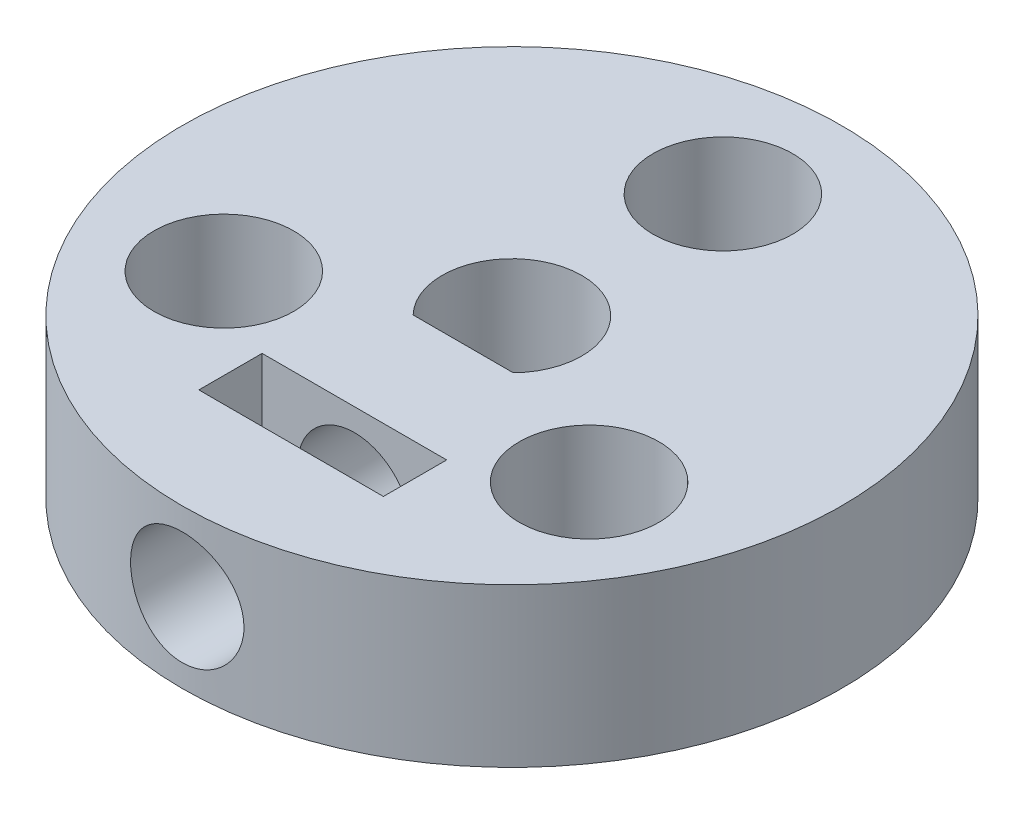
ISO-10303-21;
HEADER;
FILE_DESCRIPTION(('STEP AP214'),'2;1');
FILE_NAME('part.step','',(''),(''),'','','');
FILE_SCHEMA(('AUTOMOTIVE_DESIGN { 1 0 10303 214 1 1 1 1 }'));
ENDSEC;
DATA;
#1=APPLICATION_CONTEXT('core data for automotive mechanical design processes');
#2=APPLICATION_PROTOCOL_DEFINITION('international standard','automotive_design',2000,#1);
#3=PRODUCT_CONTEXT('',#1,'mechanical');
#4=PRODUCT('Part','Part','',(#3));
#5=PRODUCT_RELATED_PRODUCT_CATEGORY('part','',(#4));
#6=PRODUCT_DEFINITION_FORMATION('','',#4);
#7=PRODUCT_DEFINITION_CONTEXT('part definition',#1,'design');
#8=PRODUCT_DEFINITION('design','',#6,#7);
#9=PRODUCT_DEFINITION_SHAPE('','',#8);
#10=(LENGTH_UNIT() NAMED_UNIT(*) SI_UNIT(.MILLI.,.METRE.));
#11=(NAMED_UNIT(*) PLANE_ANGLE_UNIT() SI_UNIT($,.RADIAN.));
#12=(NAMED_UNIT(*) SI_UNIT($,.STERADIAN.) SOLID_ANGLE_UNIT());
#13=UNCERTAINTY_MEASURE_WITH_UNIT(LENGTH_MEASURE(1.E-05),#10,'distance_accuracy_value','');
#14=(GEOMETRIC_REPRESENTATION_CONTEXT(3) GLOBAL_UNCERTAINTY_ASSIGNED_CONTEXT((#13)) GLOBAL_UNIT_ASSIGNED_CONTEXT((#10,
#11,#12)) REPRESENTATION_CONTEXT('',''));
#15=CARTESIAN_POINT('',(0.,0.,0.));
#16=DIRECTION('',(0.,0.,1.));
#17=DIRECTION('',(1.,0.,0.));
#18=AXIS2_PLACEMENT_3D('',#15,#16,#17);
#19=CARTESIAN_POINT('',(0.,6.,0.));
#20=DIRECTION('',(0.,-1.,0.));
#21=DIRECTION('',(0.,0.,-1.));
#22=AXIS2_PLACEMENT_3D('',#19,#20,#21);
#23=CYLINDRICAL_SURFACE('',#22,12.5);
#24=CARTESIAN_POINT('',(0.,6.,0.));
#25=DIRECTION('',(0.,1.,0.));
#26=DIRECTION('',(0.,0.,1.));
#27=AXIS2_PLACEMENT_3D('',#24,#25,#26);
#28=CIRCLE('',#27,12.5);
#29=CARTESIAN_POINT('',(0.,6.,12.5));
#30=VERTEX_POINT('',#29);
#31=EDGE_CURVE('E11',#30,#30,#28,.T.);
#32=ORIENTED_EDGE('',*,*,#31,.F.);
#33=EDGE_LOOP('',(#32));
#34=FACE_BOUND('',#33,.T.);
#35=CARTESIAN_POINT('',(0.,0.,0.));
#36=DIRECTION('',(0.,1.,0.));
#37=DIRECTION('',(0.,0.,1.));
#38=AXIS2_PLACEMENT_3D('',#35,#36,#37);
#39=CIRCLE('',#38,12.5);
#40=CARTESIAN_POINT('',(0.,0.,12.5));
#41=VERTEX_POINT('',#40);
#42=EDGE_CURVE('E42',#41,#41,#39,.T.);
#43=ORIENTED_EDGE('',*,*,#42,.T.);
#44=EDGE_LOOP('',(#43));
#45=FACE_BOUND('',#44,.T.);
#46=CARTESIAN_POINT('',(2.15,3.,12.3137118692943));
#47=CARTESIAN_POINT('',(2.14999523512058,3.11980416009532,12.3137140770646));
#48=CARTESIAN_POINT('',(2.13995232522662,3.23967232651527,12.3154792484177));
#49=CARTESIAN_POINT('',(2.10006584294662,3.47604128226782,12.3223422036724));
#50=CARTESIAN_POINT('',(2.0702043695401,3.59253892782505,12.3274430004002));
#51=CARTESIAN_POINT('',(1.99161427828626,3.81871203809173,12.3403827913077));
#52=CARTESIAN_POINT('',(1.94290187028168,3.92839327041843,12.3482194323808));
#53=CARTESIAN_POINT('',(1.82803371245467,4.13801540896396,12.3657451390108));
#54=CARTESIAN_POINT('',(1.76187977704996,4.23795732686974,12.3754340118538));
#55=CARTESIAN_POINT('',(1.6132663044418,4.42632309518145,12.3956860501078));
#56=CARTESIAN_POINT('',(1.53065945452883,4.51462994679526,12.4062565724943));
#57=CARTESIAN_POINT('',(1.35180343371248,4.6762018723454,12.4270156183443));
#58=CARTESIAN_POINT('',(1.25555343411335,4.74946603191429,12.4372041185559));
#59=CARTESIAN_POINT('',(1.05138257583156,4.87931431556168,12.4561292552848));
#60=CARTESIAN_POINT('',(0.943391265372705,4.93578919148946,12.464856227903));
#61=CARTESIAN_POINT('',(0.719279368598096,5.02975318797184,12.479793025359));
#62=CARTESIAN_POINT('',(0.603159345566699,5.06724362258606,12.4860030244101));
#63=CARTESIAN_POINT('',(0.367296001481081,5.12181568075943,12.4951542325278));
#64=CARTESIAN_POINT('',(0.247599446496765,5.13909406206646,12.4981269356312));
#65=CARTESIAN_POINT('',(0.00697182502378487,5.15336368006842,12.500576900139));
#66=CARTESIAN_POINT('',(-0.11395915171639,5.15035638128843,12.5000544138788));
#67=CARTESIAN_POINT('',(-0.352276552091909,5.1242928252659,12.4955977220906));
#68=CARTESIAN_POINT('',(-0.469686907105693,5.10144834359743,12.4916995554795));
#69=CARTESIAN_POINT('',(-0.698982638401656,5.03669272377834,12.48096973508));
#70=CARTESIAN_POINT('',(-0.810867837833076,4.99478097575518,12.4741379874605));
#71=CARTESIAN_POINT('',(-1.02656324228791,4.89287221966631,12.4582475265903));
#72=CARTESIAN_POINT('',(-1.13033170674949,4.83278859007667,12.4491781862258));
#73=CARTESIAN_POINT('',(-1.32639319040894,4.69630517180203,12.4298190360616));
#74=CARTESIAN_POINT('',(-1.41868522096564,4.61990397897372,12.419529121264));
#75=CARTESIAN_POINT('',(-1.59042613389989,4.45178142118165,12.3987151855607));
#76=CARTESIAN_POINT('',(-1.66969372028435,4.35987491105816,12.3881898575719));
#77=CARTESIAN_POINT('',(-1.81171308204382,4.16397268273662,12.3682195486175));
#78=CARTESIAN_POINT('',(-1.8744646852251,4.05997683851285,12.3587745789162));
#79=CARTESIAN_POINT('',(-1.98171032999896,3.84263039114169,12.3420333895227));
#80=CARTESIAN_POINT('',(-2.02618144008044,3.72926825135463,12.3347398718837));
#81=CARTESIAN_POINT('',(-2.09539849731496,3.49652896689196,12.32317120851));
#82=CARTESIAN_POINT('',(-2.12014630177335,3.37715238971012,12.3188957785722));
#83=CARTESIAN_POINT('',(-2.14895666389343,3.13739812524455,12.3139026785409));
#84=CARTESIAN_POINT('',(-2.15327815678057,3.01705245140095,12.3131404759316));
#85=CARTESIAN_POINT('',(-2.14180424902303,2.77735784204362,12.3151413798204));
#86=CARTESIAN_POINT('',(-2.12600967824831,2.65800886561648,12.3179043408911));
#87=CARTESIAN_POINT('',(-2.07497314222381,2.4245250724513,12.3266030290423));
#88=CARTESIAN_POINT('',(-2.03986394143355,2.31036035615583,12.3325170875425));
#89=CARTESIAN_POINT('',(-1.95133440471402,2.08953472165864,12.3468333046011));
#90=CARTESIAN_POINT('',(-1.89791290977061,1.98287427892942,12.3552356206407));
#91=CARTESIAN_POINT('',(-1.77366783491972,1.77893533733172,12.3736845927819));
#92=CARTESIAN_POINT('',(-1.7026789002696,1.68175898654014,12.3837465514737));
#93=CARTESIAN_POINT('',(-1.54554003352175,1.50060481294295,12.4043367500405));
#94=CARTESIAN_POINT('',(-1.45938896285976,1.41662798222081,12.414865024888));
#95=CARTESIAN_POINT('',(-1.27322184032392,1.26330576352965,12.4353430002284));
#96=CARTESIAN_POINT('',(-1.17306229228865,1.19413342061692,12.4452849671113));
#97=CARTESIAN_POINT('',(-0.96239355163567,1.07359805491092,12.463344628757));
#98=CARTESIAN_POINT('',(-0.85188471048062,1.02223442761088,12.4714623854382));
#99=CARTESIAN_POINT('',(-0.624159537877468,0.939041305687561,12.4849254493442));
#100=CARTESIAN_POINT('',(-0.506976565115973,0.9071226317407,12.4902833959735));
#101=CARTESIAN_POINT('',(-0.268813454064623,0.863438889378121,12.4976767018206));
#102=CARTESIAN_POINT('',(-0.147833650386974,0.851672050045107,12.4997123529968));
#103=CARTESIAN_POINT('',(0.0928214209370931,0.848679586537874,12.5002271669382));
#104=CARTESIAN_POINT('',(0.212493404229969,0.85719115485527,12.4987518322445));
#105=CARTESIAN_POINT('',(0.448676000370172,0.893943700376464,12.492503738834));
#106=CARTESIAN_POINT('',(0.565186633792047,0.922184549147093,12.4877310015825));
#107=CARTESIAN_POINT('',(0.791629347641567,0.997490658558319,12.4754228533213));
#108=CARTESIAN_POINT('',(0.901569524036275,1.04453217976856,12.4678909273093));
#109=CARTESIAN_POINT('',(1.11203684347077,1.15607452695737,12.4508849134721));
#110=CARTESIAN_POINT('',(1.21256349345213,1.22057626677355,12.4414107239985));
#111=CARTESIAN_POINT('',(1.40267067903647,1.36613319180138,12.4214240278329));
#112=CARTESIAN_POINT('',(1.49210316364768,1.44738022085855,12.4109002911752));
#113=CARTESIAN_POINT('',(1.65615738647813,1.62371972812979,12.3900766153397));
#114=CARTESIAN_POINT('',(1.73077564976339,1.7188154457484,12.3797767291733));
#115=CARTESIAN_POINT('',(1.8636070111843,1.92101206629418,12.3604822378488));
#116=CARTESIAN_POINT('',(1.92169126937328,2.02819862602798,12.3514981353079));
#117=CARTESIAN_POINT('',(2.01893940789672,2.25092081171649,12.3359770256205));
#118=CARTESIAN_POINT('',(2.05812193626849,2.36644807897341,12.3294376080407));
#119=CARTESIAN_POINT('',(2.10807759763052,2.56866651038761,12.3209755030038));
#120=CARTESIAN_POINT('',(2.12377286240474,2.65414255269861,12.3182670340709));
#121=CARTESIAN_POINT('',(2.14473568487324,2.82640121061802,12.3146344352781));
#122=CARTESIAN_POINT('',(2.15000345287447,2.91318379983977,12.3137102694315));
#123=CARTESIAN_POINT('',(2.15,3.,12.3137118692943));
#124=B_SPLINE_CURVE_WITH_KNOTS('',3,(#46,#47,#48,#49,#50,#51,#52,#53,#54,#55,#56,#57,#58,#59,
#60,#61,#62,#63,#64,#65,#66,#67,#68,#69,#70,#71,#72,#73,#74,#75,#76,#77,#78,#79,#80,#81,#82,#83,
#84,#85,#86,#87,#88,#89,#90,#91,#92,#93,#94,#95,#96,#97,#98,#99,#100,#101,#102,#103,#104,#105,
#106,#107,#108,#109,#110,#111,#112,#113,#114,#115,#116,#117,#118,#119,#120,#121,#122,#123),
.UNSPECIFIED.,.T.,.F.,(4,2,2,2,2,2,2,2,2,2,2,2,2,2,2,2,2,2,2,2,2,2,2,2,2,2,2,2,2,2,2,2,2,2,2,2,
2,2,4),(0.,0.359094953771007,0.718514700533363,1.07762606800529,1.43670009235372,
1.7991466809144,2.16161529421027,2.52639331601842,2.89114608527394,3.25231775149959,
3.61346334320867,3.97080020746036,4.32814850204867,4.68722779087923,5.04633799131521,
5.41008687068965,5.77383954231768,6.13804713214381,6.50222042119539,6.861764639213,
7.22129402504035,7.57838241741689,7.93549341465846,8.29610289680723,8.65673946962372,
9.02138543167999,9.38601901482349,9.74896745596803,10.1118840000336,10.4701227949832,
10.8283592579006,11.1861448009903,11.5439490735776,11.9061064319091,12.2683486404564,
12.6333408070087,12.9979721399905,13.2581958929518,13.5184143975372),.UNSPECIFIED.);
#125=CARTESIAN_POINT('',(2.15,3.,12.3137118692943));
#126=VERTEX_POINT('',#125);
#127=EDGE_CURVE('E175',#126,#126,#124,.T.);
#128=ORIENTED_EDGE('',*,*,#127,.F.);
#129=EDGE_LOOP('',(#128));
#130=FACE_BOUND('',#129,.T.);
#131=ADVANCED_FACE('F33',(#34,#45,#130),#23,.T.);
#132=CARTESIAN_POINT('',(0.,-0.00100000000000013,1.85));
#133=DIRECTION('',(0.,0.,1.));
#134=DIRECTION('',(1.,0.,0.));
#135=AXIS2_PLACEMENT_3D('',#132,#133,#134);
#136=PLANE('',#135);
#137=CARTESIAN_POINT('',(0.,3.,1.85));
#138=DIRECTION('',(0.,0.,1.));
#139=DIRECTION('',(1.,0.,0.));
#140=AXIS2_PLACEMENT_3D('',#137,#138,#139);
#141=CIRCLE('',#140,2.15);
#142=CARTESIAN_POINT('',(1.89736659610103,1.98881257919217,1.85));
#143=VERTEX_POINT('',#142);
#144=CARTESIAN_POINT('',(-1.89736659610103,1.98881257919217,1.85));
#145=VERTEX_POINT('',#144);
#146=EDGE_CURVE('E100',#143,#145,#141,.F.);
#147=ORIENTED_EDGE('',*,*,#146,.F.);
#148=DIRECTION('',(0.,1.,0.));
#149=VECTOR('',#148,1.);
#150=CARTESIAN_POINT('',(1.89736659610103,-0.00100000000000013,1.85));
#151=LINE('',#150,#149);
#152=CARTESIAN_POINT('',(1.89736659610103,0.,1.85));
#153=VERTEX_POINT('',#152);
#154=EDGE_CURVE('E110',#153,#143,#151,.T.);
#155=ORIENTED_EDGE('',*,*,#154,.F.);
#156=DIRECTION('',(-1.,0.,0.));
#157=VECTOR('',#156,1.);
#158=CARTESIAN_POINT('',(0.,0.,1.85));
#159=LINE('',#158,#157);
#160=CARTESIAN_POINT('',(-1.89736659610103,0.,1.85));
#161=VERTEX_POINT('',#160);
#162=EDGE_CURVE('E218',#153,#161,#159,.T.);
#163=ORIENTED_EDGE('',*,*,#162,.T.);
#164=DIRECTION('',(0.,1.,0.));
#165=VECTOR('',#164,1.);
#166=CARTESIAN_POINT('',(-1.89736659610103,-0.00100000000000013,1.85));
#167=LINE('',#166,#165);
#168=EDGE_CURVE('E113',#161,#145,#167,.T.);
#169=ORIENTED_EDGE('',*,*,#168,.T.);
#170=EDGE_LOOP('',(#147,#155,#163,#169));
#171=FACE_BOUND('',#170,.T.);
#172=ADVANCED_FACE('F109',(#171),#136,.F.);
#173=CARTESIAN_POINT('',(0.,-0.00100000000000013,0.));
#174=DIRECTION('',(0.,1.,0.));
#175=DIRECTION('',(0.,0.,1.));
#176=AXIS2_PLACEMENT_3D('',#173,#174,#175);
#177=CYLINDRICAL_SURFACE('',#176,2.65);
#178=CARTESIAN_POINT('',(-1.89736659610103,1.98881257919217,1.85));
#179=CARTESIAN_POINT('',(-1.91720669890696,2.02605383556159,1.82965527369401));
#180=CARTESIAN_POINT('',(-1.93603961831095,2.06401971105243,1.80968093366379));
#181=CARTESIAN_POINT('',(-1.97164111491819,2.14153571782848,1.77082619429323));
#182=CARTESIAN_POINT('',(-1.98840633124944,2.18108829341598,1.75194760168542));
#183=CARTESIAN_POINT('',(-2.03584649348657,2.30320759708302,1.6971075649108));
#184=CARTESIAN_POINT('',(-2.06313835646978,2.38825939658803,1.66349862884322));
#185=CARTESIAN_POINT('',(-2.10339037462589,2.54857926525862,1.61218052637965));
#186=CARTESIAN_POINT('',(-2.118049378749,2.62283689732512,1.59269547151605));
#187=CARTESIAN_POINT('',(-2.13944235239509,2.77403407288728,1.56384757679862));
#188=CARTESIAN_POINT('',(-2.14622539705263,2.85095389950346,1.55442208585384));
#189=CARTESIAN_POINT('',(-2.15139987385191,3.0061574240331,1.54725764209384));
#190=CARTESIAN_POINT('',(-2.14973644777306,3.08444673836905,1.54959508642809));
#191=CARTESIAN_POINT('',(-2.13805336890989,3.23937212965978,1.56566708620453));
#192=CARTESIAN_POINT('',(-2.12800719982723,3.31600216785323,1.57943780670327));
#193=CARTESIAN_POINT('',(-2.09643886532097,3.48682358675667,1.62120125478484));
#194=CARTESIAN_POINT('',(-2.07246626737269,3.57981480742485,1.65212404189149));
#195=CARTESIAN_POINT('',(-2.01394064273109,3.75857176502394,1.72297277737756));
#196=CARTESIAN_POINT('',(-1.9793807698391,3.84433278069162,1.76290454694579));
#197=CARTESIAN_POINT('',(-1.92641869280659,3.9551983048563,1.81984352566436));
#198=CARTESIAN_POINT('',(-1.91216708745196,3.98340437607689,1.83482858497551));
#199=CARTESIAN_POINT('',(-1.89736659610105,4.01118742080784,1.85000000000001));
#200=B_SPLINE_CURVE_WITH_KNOTS('',3,(#178,#179,#180,#181,#182,#183,#184,#185,#186,#187,#188,
#189,#190,#191,#192,#193,#194,#195,#196,#197,#198,#199),.UNSPECIFIED.,.F.,.F.,(4,2,2,2,2,2,2,2,
2,2,4),(0.,0.14048637773369,0.281198175850233,0.566322323145036,0.799908155945843,
1.03203056861612,1.2656624929399,1.50003625592549,1.80103448372852,2.10222776257815,
2.20710702633954),.UNSPECIFIED.);
#201=CARTESIAN_POINT('',(-1.89736659610103,4.01118742080783,1.85));
#202=VERTEX_POINT('',#201);
#203=EDGE_CURVE('E114',#145,#202,#200,.T.);
#204=ORIENTED_EDGE('',*,*,#203,.F.);
#205=ORIENTED_EDGE('',*,*,#168,.F.);
#206=CARTESIAN_POINT('',(0.,0.,0.));
#207=DIRECTION('',(0.,1.,0.));
#208=DIRECTION('',(0.,0.,1.));
#209=AXIS2_PLACEMENT_3D('',#206,#207,#208);
#210=CIRCLE('',#209,2.65);
#211=EDGE_CURVE('E118',#161,#153,#210,.F.);
#212=ORIENTED_EDGE('',*,*,#211,.T.);
#213=ORIENTED_EDGE('',*,*,#154,.T.);
#214=CARTESIAN_POINT('',(1.89736659610103,4.01118742080783,1.85));
#215=CARTESIAN_POINT('',(1.91720669890695,3.97394616443841,1.82965527369401));
#216=CARTESIAN_POINT('',(1.93603961831095,3.93598028894757,1.80968093366379));
#217=CARTESIAN_POINT('',(1.97164111491819,3.85846428217152,1.77082619429323));
#218=CARTESIAN_POINT('',(1.98840633124944,3.81891170658402,1.75194760168542));
#219=CARTESIAN_POINT('',(2.03584649348657,3.69679240291698,1.6971075649108));
#220=CARTESIAN_POINT('',(2.06313835646978,3.61174060341196,1.66349862884322));
#221=CARTESIAN_POINT('',(2.10339037462589,3.45142073474138,1.61218052637965));
#222=CARTESIAN_POINT('',(2.118049378749,3.37716310267488,1.59269547151605));
#223=CARTESIAN_POINT('',(2.13944235239509,3.22596592711272,1.56384757679862));
#224=CARTESIAN_POINT('',(2.14622539705263,3.14904610049654,1.55442208585384));
#225=CARTESIAN_POINT('',(2.15139987385191,2.9938425759669,1.54725764209384));
#226=CARTESIAN_POINT('',(2.14973644777306,2.91555326163095,1.54959508642809));
#227=CARTESIAN_POINT('',(2.13805336890989,2.76062787034022,1.56566708620453));
#228=CARTESIAN_POINT('',(2.12800719982723,2.68399783214677,1.57943780670327));
#229=CARTESIAN_POINT('',(2.09643886532097,2.51317641324333,1.62120125478484));
#230=CARTESIAN_POINT('',(2.0724662673727,2.42018519257515,1.65212404189149));
#231=CARTESIAN_POINT('',(2.01394064273109,2.24142823497606,1.72297277737756));
#232=CARTESIAN_POINT('',(1.9793807698391,2.15566721930838,1.76290454694579));
#233=CARTESIAN_POINT('',(1.92641869280659,2.0448016951437,1.81984352566436));
#234=CARTESIAN_POINT('',(1.91216708745196,2.01659562392311,1.83482858497551));
#235=CARTESIAN_POINT('',(1.89736659610105,1.98881257919216,1.85000000000001));
#236=B_SPLINE_CURVE_WITH_KNOTS('',3,(#214,#215,#216,#217,#218,#219,#220,#221,#222,#223,#224,
#225,#226,#227,#228,#229,#230,#231,#232,#233,#234,#235),.UNSPECIFIED.,.F.,.F.,(4,2,2,2,2,2,2,2,
2,2,4),(0.,0.14048637773369,0.281198175850233,0.566322323145035,0.799908155945843,
1.03203056861612,1.2656624929399,1.50003625592549,1.80103448372852,2.10222776257815,
2.20710702633954),.UNSPECIFIED.);
#237=CARTESIAN_POINT('',(1.89736659610103,4.01118742080783,1.85));
#238=VERTEX_POINT('',#237);
#239=EDGE_CURVE('E97',#238,#143,#236,.T.);
#240=ORIENTED_EDGE('',*,*,#239,.F.);
#241=CARTESIAN_POINT('',(1.89736659610103,6.,1.85));
#242=VERTEX_POINT('',#241);
#243=EDGE_CURVE('E121',#238,#242,#151,.T.);
#244=ORIENTED_EDGE('',*,*,#243,.T.);
#245=CARTESIAN_POINT('',(0.,6.,0.));
#246=DIRECTION('',(0.,1.,0.));
#247=DIRECTION('',(0.,0.,1.));
#248=AXIS2_PLACEMENT_3D('',#245,#246,#247);
#249=CIRCLE('',#248,2.65);
#250=CARTESIAN_POINT('',(-1.89736659610103,6.,1.85));
#251=VERTEX_POINT('',#250);
#252=EDGE_CURVE('E124',#242,#251,#249,.T.);
#253=ORIENTED_EDGE('',*,*,#252,.T.);
#254=EDGE_CURVE('E120',#202,#251,#167,.T.);
#255=ORIENTED_EDGE('',*,*,#254,.F.);
#256=EDGE_LOOP('',(#204,#205,#212,#213,#240,#244,#253,#255));
#257=FACE_BOUND('',#256,.T.);
#258=ADVANCED_FACE('F116',(#257),#177,.F.);
#259=CARTESIAN_POINT('',(0.,6.,0.));
#260=DIRECTION('',(0.,1.,0.));
#261=DIRECTION('',(0.,0.,1.));
#262=AXIS2_PLACEMENT_3D('',#259,#260,#261);
#263=PLANE('',#262);
#264=CARTESIAN_POINT('',(0.,6.,-8.));
#265=DIRECTION('',(0.,1.,0.));
#266=DIRECTION('',(0.,0.,1.));
#267=AXIS2_PLACEMENT_3D('',#264,#265,#266);
#268=CIRCLE('',#267,2.65);
#269=CARTESIAN_POINT('',(0.,6.,-5.35));
#270=VERTEX_POINT('',#269);
#271=EDGE_CURVE('E357',#270,#270,#268,.T.);
#272=ORIENTED_EDGE('',*,*,#271,.F.);
#273=EDGE_LOOP('',(#272));
#274=FACE_BOUND('',#273,.T.);
#275=CARTESIAN_POINT('',(6.92820323027585,6.,3.9999999999998));
#276=DIRECTION('',(0.,1.,0.));
#277=DIRECTION('',(0.,0.,1.));
#278=AXIS2_PLACEMENT_3D('',#275,#276,#277);
#279=CIRCLE('',#278,2.6500000000003);
#280=CARTESIAN_POINT('',(6.92820323027585,6.,6.65000000000011));
#281=VERTEX_POINT('',#280);
#282=EDGE_CURVE('E362',#281,#281,#279,.T.);
#283=ORIENTED_EDGE('',*,*,#282,.F.);
#284=EDGE_LOOP('',(#283));
#285=FACE_BOUND('',#284,.T.);
#286=CARTESIAN_POINT('',(-6.92820323027517,6.,4.0000000000002));
#287=DIRECTION('',(0.,1.,0.));
#288=DIRECTION('',(0.,0.,1.));
#289=AXIS2_PLACEMENT_3D('',#286,#287,#288);
#290=CIRCLE('',#289,2.65000000000045);
#291=CARTESIAN_POINT('',(-6.92820323027517,6.,6.65000000000065));
#292=VERTEX_POINT('',#291);
#293=EDGE_CURVE('E370',#292,#292,#290,.T.);
#294=ORIENTED_EDGE('',*,*,#293,.F.);
#295=EDGE_LOOP('',(#294));
#296=FACE_BOUND('',#295,.T.);
#297=DIRECTION('',(0.,0.,-1.));
#298=VECTOR('',#297,1.);
#299=CARTESIAN_POINT('',(3.5,6.,8.375));
#300=LINE('',#299,#298);
#301=CARTESIAN_POINT('',(3.5,6.,8.375));
#302=VERTEX_POINT('',#301);
#303=CARTESIAN_POINT('',(3.5,6.,5.975));
#304=VERTEX_POINT('',#303);
#305=EDGE_CURVE('E58',#302,#304,#300,.T.);
#306=ORIENTED_EDGE('',*,*,#305,.F.);
#307=DIRECTION('',(1.,0.,0.));
#308=VECTOR('',#307,1.);
#309=CARTESIAN_POINT('',(-3.5,6.,8.375));
#310=LINE('',#309,#308);
#311=CARTESIAN_POINT('',(-3.5,6.,8.375));
#312=VERTEX_POINT('',#311);
#313=EDGE_CURVE('E237',#312,#302,#310,.T.);
#314=ORIENTED_EDGE('',*,*,#313,.F.);
#315=DIRECTION('',(0.,0.,1.));
#316=VECTOR('',#315,1.);
#317=CARTESIAN_POINT('',(-3.5,6.,8.375));
#318=LINE('',#317,#316);
#319=CARTESIAN_POINT('',(-3.5,6.,5.975));
#320=VERTEX_POINT('',#319);
#321=EDGE_CURVE('E234',#320,#312,#318,.T.);
#322=ORIENTED_EDGE('',*,*,#321,.F.);
#323=DIRECTION('',(-1.,0.,0.));
#324=VECTOR('',#323,1.);
#325=CARTESIAN_POINT('',(-3.5,6.,5.975));
#326=LINE('',#325,#324);
#327=EDGE_CURVE('E228',#304,#320,#326,.T.);
#328=ORIENTED_EDGE('',*,*,#327,.F.);
#329=EDGE_LOOP('',(#306,#314,#322,#328));
#330=FACE_BOUND('',#329,.T.);
#331=DIRECTION('',(1.,0.,0.));
#332=VECTOR('',#331,1.);
#333=CARTESIAN_POINT('',(0.,6.,1.85));
#334=LINE('',#333,#332);
#335=EDGE_CURVE('E246',#251,#242,#334,.T.);
#336=ORIENTED_EDGE('',*,*,#335,.F.);
#337=ORIENTED_EDGE('',*,*,#252,.F.);
#338=EDGE_LOOP('',(#336,#337));
#339=FACE_BOUND('',#338,.T.);
#340=ORIENTED_EDGE('',*,*,#31,.T.);
#341=EDGE_LOOP('',(#340));
#342=FACE_BOUND('',#341,.T.);
#343=ADVANCED_FACE('F135',(#274,#285,#296,#330,#339,#342),#263,.T.);
#344=CARTESIAN_POINT('',(0.,0.,0.));
#345=DIRECTION('',(0.,1.,0.));
#346=DIRECTION('',(0.,0.,1.));
#347=AXIS2_PLACEMENT_3D('',#344,#345,#346);
#348=PLANE('',#347);
#349=CARTESIAN_POINT('',(0.,0.,-8.));
#350=DIRECTION('',(0.,1.,0.));
#351=DIRECTION('',(0.,0.,1.));
#352=AXIS2_PLACEMENT_3D('',#349,#350,#351);
#353=CIRCLE('',#352,2.65);
#354=CARTESIAN_POINT('',(0.,0.,-5.35));
#355=VERTEX_POINT('',#354);
#356=EDGE_CURVE('E354',#355,#355,#353,.T.);
#357=ORIENTED_EDGE('',*,*,#356,.T.);
#358=EDGE_LOOP('',(#357));
#359=FACE_BOUND('',#358,.T.);
#360=CARTESIAN_POINT('',(6.92820323027585,0.,3.9999999999998));
#361=DIRECTION('',(0.,1.,0.));
#362=DIRECTION('',(0.,0.,1.));
#363=AXIS2_PLACEMENT_3D('',#360,#361,#362);
#364=CIRCLE('',#363,2.6500000000003);
#365=CARTESIAN_POINT('',(6.92820323027585,0.,6.65000000000011));
#366=VERTEX_POINT('',#365);
#367=EDGE_CURVE('E358',#366,#366,#364,.T.);
#368=ORIENTED_EDGE('',*,*,#367,.T.);
#369=EDGE_LOOP('',(#368));
#370=FACE_BOUND('',#369,.T.);
#371=CARTESIAN_POINT('',(-6.92820323027517,0.,4.0000000000002));
#372=DIRECTION('',(0.,1.,0.));
#373=DIRECTION('',(0.,0.,1.));
#374=AXIS2_PLACEMENT_3D('',#371,#372,#373);
#375=CIRCLE('',#374,2.65000000000045);
#376=CARTESIAN_POINT('',(-6.92820323027517,0.,6.65000000000065));
#377=VERTEX_POINT('',#376);
#378=EDGE_CURVE('E367',#377,#377,#375,.T.);
#379=ORIENTED_EDGE('',*,*,#378,.T.);
#380=EDGE_LOOP('',(#379));
#381=FACE_BOUND('',#380,.T.);
#382=DIRECTION('',(-1.,0.,0.));
#383=VECTOR('',#382,1.);
#384=CARTESIAN_POINT('',(-3.5,0.,8.375));
#385=LINE('',#384,#383);
#386=CARTESIAN_POINT('',(3.5,0.,8.375));
#387=VERTEX_POINT('',#386);
#388=CARTESIAN_POINT('',(-3.5,0.,8.375));
#389=VERTEX_POINT('',#388);
#390=EDGE_CURVE('E226',#387,#389,#385,.T.);
#391=ORIENTED_EDGE('',*,*,#390,.F.);
#392=DIRECTION('',(0.,0.,1.));
#393=VECTOR('',#392,1.);
#394=CARTESIAN_POINT('',(3.5,0.,8.375));
#395=LINE('',#394,#393);
#396=CARTESIAN_POINT('',(3.5,0.,5.975));
#397=VERTEX_POINT('',#396);
#398=EDGE_CURVE('E223',#397,#387,#395,.T.);
#399=ORIENTED_EDGE('',*,*,#398,.F.);
#400=DIRECTION('',(1.,0.,0.));
#401=VECTOR('',#400,1.);
#402=CARTESIAN_POINT('',(-3.5,0.,5.975));
#403=LINE('',#402,#401);
#404=CARTESIAN_POINT('',(-3.5,0.,5.975));
#405=VERTEX_POINT('',#404);
#406=EDGE_CURVE('E210',#405,#397,#403,.T.);
#407=ORIENTED_EDGE('',*,*,#406,.F.);
#408=DIRECTION('',(0.,0.,-1.));
#409=VECTOR('',#408,1.);
#410=CARTESIAN_POINT('',(-3.5,0.,8.375));
#411=LINE('',#410,#409);
#412=EDGE_CURVE('E230',#389,#405,#411,.T.);
#413=ORIENTED_EDGE('',*,*,#412,.F.);
#414=EDGE_LOOP('',(#391,#399,#407,#413));
#415=FACE_BOUND('',#414,.T.);
#416=ORIENTED_EDGE('',*,*,#211,.F.);
#417=ORIENTED_EDGE('',*,*,#162,.F.);
#418=EDGE_LOOP('',(#416,#417));
#419=FACE_BOUND('',#418,.T.);
#420=ORIENTED_EDGE('',*,*,#42,.F.);
#421=EDGE_LOOP('',(#420));
#422=FACE_BOUND('',#421,.T.);
#423=ADVANCED_FACE('F132',(#359,#370,#381,#415,#419,#422),#348,.F.);
#424=EDGE_CURVE('E50',#202,#238,#141,.F.);
#425=ORIENTED_EDGE('',*,*,#424,.F.);
#426=ORIENTED_EDGE('',*,*,#254,.T.);
#427=ORIENTED_EDGE('',*,*,#335,.T.);
#428=ORIENTED_EDGE('',*,*,#243,.F.);
#429=EDGE_LOOP('',(#425,#426,#427,#428));
#430=FACE_BOUND('',#429,.T.);
#431=ADVANCED_FACE('F134',(#430),#136,.F.);
#432=CARTESIAN_POINT('',(3.5,-0.00100000000000013,8.375));
#433=DIRECTION('',(1.,0.,0.));
#434=DIRECTION('',(0.,0.,-1.));
#435=AXIS2_PLACEMENT_3D('',#432,#433,#434);
#436=PLANE('',#435);
#437=ORIENTED_EDGE('',*,*,#398,.T.);
#438=DIRECTION('',(0.,1.,0.));
#439=VECTOR('',#438,1.);
#440=CARTESIAN_POINT('',(3.5,-0.00100000000000013,8.375));
#441=LINE('',#440,#439);
#442=EDGE_CURVE('E219',#387,#302,#441,.T.);
#443=ORIENTED_EDGE('',*,*,#442,.T.);
#444=ORIENTED_EDGE('',*,*,#305,.T.);
#445=DIRECTION('',(0.,1.,0.));
#446=VECTOR('',#445,1.);
#447=CARTESIAN_POINT('',(3.5,-0.00100000000000013,5.975));
#448=LINE('',#447,#446);
#449=EDGE_CURVE('E213',#397,#304,#448,.T.);
#450=ORIENTED_EDGE('',*,*,#449,.F.);
#451=EDGE_LOOP('',(#437,#443,#444,#450));
#452=FACE_BOUND('',#451,.T.);
#453=ADVANCED_FACE('F141',(#452),#436,.F.);
#454=CARTESIAN_POINT('',(-3.5,-0.00100000000000013,8.375));
#455=DIRECTION('',(0.,0.,1.));
#456=DIRECTION('',(1.,0.,0.));
#457=AXIS2_PLACEMENT_3D('',#454,#455,#456);
#458=PLANE('',#457);
#459=CARTESIAN_POINT('',(0.,3.,8.375));
#460=DIRECTION('',(0.,0.,1.));
#461=DIRECTION('',(1.,0.,0.));
#462=AXIS2_PLACEMENT_3D('',#459,#460,#461);
#463=CIRCLE('',#462,2.15);
#464=CARTESIAN_POINT('',(2.15,3.,8.375));
#465=VERTEX_POINT('',#464);
#466=EDGE_CURVE('E105',#465,#465,#463,.F.);
#467=ORIENTED_EDGE('',*,*,#466,.F.);
#468=EDGE_LOOP('',(#467));
#469=FACE_BOUND('',#468,.T.);
#470=ORIENTED_EDGE('',*,*,#390,.T.);
#471=DIRECTION('',(0.,1.,0.));
#472=VECTOR('',#471,1.);
#473=CARTESIAN_POINT('',(-3.5,-0.00100000000000013,8.375));
#474=LINE('',#473,#472);
#475=EDGE_CURVE('E241',#389,#312,#474,.T.);
#476=ORIENTED_EDGE('',*,*,#475,.T.);
#477=ORIENTED_EDGE('',*,*,#313,.T.);
#478=ORIENTED_EDGE('',*,*,#442,.F.);
#479=EDGE_LOOP('',(#470,#476,#477,#478));
#480=FACE_BOUND('',#479,.T.);
#481=ADVANCED_FACE('F188',(#469,#480),#458,.F.);
#482=CARTESIAN_POINT('',(-3.5,-0.00100000000000013,8.375));
#483=DIRECTION('',(-1.,0.,0.));
#484=DIRECTION('',(0.,0.,1.));
#485=AXIS2_PLACEMENT_3D('',#482,#483,#484);
#486=PLANE('',#485);
#487=ORIENTED_EDGE('',*,*,#412,.T.);
#488=DIRECTION('',(0.,1.,0.));
#489=VECTOR('',#488,1.);
#490=CARTESIAN_POINT('',(-3.5,-0.00100000000000013,5.975));
#491=LINE('',#490,#489);
#492=EDGE_CURVE('E215',#405,#320,#491,.T.);
#493=ORIENTED_EDGE('',*,*,#492,.T.);
#494=ORIENTED_EDGE('',*,*,#321,.T.);
#495=ORIENTED_EDGE('',*,*,#475,.F.);
#496=EDGE_LOOP('',(#487,#493,#494,#495));
#497=FACE_BOUND('',#496,.T.);
#498=ADVANCED_FACE('F193',(#497),#486,.F.);
#499=CARTESIAN_POINT('',(-3.5,-0.00100000000000013,5.975));
#500=DIRECTION('',(0.,0.,-1.));
#501=DIRECTION('',(-1.,0.,0.));
#502=AXIS2_PLACEMENT_3D('',#499,#500,#501);
#503=PLANE('',#502);
#504=CARTESIAN_POINT('',(0.,3.,5.975));
#505=DIRECTION('',(0.,0.,-1.));
#506=DIRECTION('',(-1.,0.,0.));
#507=AXIS2_PLACEMENT_3D('',#504,#505,#506);
#508=CIRCLE('',#507,2.15);
#509=CARTESIAN_POINT('',(-2.15,3.,5.975));
#510=VERTEX_POINT('',#509);
#511=EDGE_CURVE('E37',#510,#510,#508,.F.);
#512=ORIENTED_EDGE('',*,*,#511,.F.);
#513=EDGE_LOOP('',(#512));
#514=FACE_BOUND('',#513,.T.);
#515=ORIENTED_EDGE('',*,*,#406,.T.);
#516=ORIENTED_EDGE('',*,*,#449,.T.);
#517=ORIENTED_EDGE('',*,*,#327,.T.);
#518=ORIENTED_EDGE('',*,*,#492,.F.);
#519=EDGE_LOOP('',(#515,#516,#517,#518));
#520=FACE_BOUND('',#519,.T.);
#521=ADVANCED_FACE('F196',(#514,#520),#503,.F.);
#522=CARTESIAN_POINT('',(0.,3.,0.85));
#523=DIRECTION('',(0.,0.,1.));
#524=DIRECTION('',(1.,0.,0.));
#525=AXIS2_PLACEMENT_3D('',#522,#523,#524);
#526=CYLINDRICAL_SURFACE('',#525,2.15);
#527=ORIENTED_EDGE('',*,*,#511,.T.);
#528=EDGE_LOOP('',(#527));
#529=FACE_BOUND('',#528,.T.);
#530=ORIENTED_EDGE('',*,*,#203,.T.);
#531=ORIENTED_EDGE('',*,*,#424,.T.);
#532=ORIENTED_EDGE('',*,*,#239,.T.);
#533=ORIENTED_EDGE('',*,*,#146,.T.);
#534=EDGE_LOOP('',(#530,#531,#532,#533));
#535=FACE_BOUND('',#534,.T.);
#536=ADVANCED_FACE('F99',(#529,#535),#526,.F.);
#537=ORIENTED_EDGE('',*,*,#466,.T.);
#538=EDGE_LOOP('',(#537));
#539=FACE_BOUND('',#538,.T.);
#540=ORIENTED_EDGE('',*,*,#127,.T.);
#541=EDGE_LOOP('',(#540));
#542=FACE_BOUND('',#541,.T.);
#543=ADVANCED_FACE('F180',(#539,#542),#526,.F.);
#544=CARTESIAN_POINT('',(-6.92820323027517,0.,4.0000000000002));
#545=DIRECTION('',(0.,1.,0.));
#546=DIRECTION('',(0.,0.,1.));
#547=AXIS2_PLACEMENT_3D('',#544,#545,#546);
#548=CYLINDRICAL_SURFACE('',#547,2.65000000000045);
#549=ORIENTED_EDGE('',*,*,#378,.F.);
#550=EDGE_LOOP('',(#549));
#551=FACE_BOUND('',#550,.T.);
#552=ORIENTED_EDGE('',*,*,#293,.T.);
#553=EDGE_LOOP('',(#552));
#554=FACE_BOUND('',#553,.T.);
#555=ADVANCED_FACE('F185',(#551,#554),#548,.F.);
#556=CARTESIAN_POINT('',(6.92820323027585,0.,3.9999999999998));
#557=DIRECTION('',(0.,1.,0.));
#558=DIRECTION('',(0.,0.,1.));
#559=AXIS2_PLACEMENT_3D('',#556,#557,#558);
#560=CYLINDRICAL_SURFACE('',#559,2.6500000000003);
#561=ORIENTED_EDGE('',*,*,#367,.F.);
#562=EDGE_LOOP('',(#561));
#563=FACE_BOUND('',#562,.T.);
#564=ORIENTED_EDGE('',*,*,#282,.T.);
#565=EDGE_LOOP('',(#564));
#566=FACE_BOUND('',#565,.T.);
#567=ADVANCED_FACE('F330',(#563,#566),#560,.F.);
#568=CARTESIAN_POINT('',(0.,0.,-8.));
#569=DIRECTION('',(0.,1.,0.));
#570=DIRECTION('',(0.,0.,1.));
#571=AXIS2_PLACEMENT_3D('',#568,#569,#570);
#572=CYLINDRICAL_SURFACE('',#571,2.65);
#573=ORIENTED_EDGE('',*,*,#356,.F.);
#574=EDGE_LOOP('',(#573));
#575=FACE_BOUND('',#574,.T.);
#576=ORIENTED_EDGE('',*,*,#271,.T.);
#577=EDGE_LOOP('',(#576));
#578=FACE_BOUND('',#577,.T.);
#579=ADVANCED_FACE('F336',(#575,#578),#572,.F.);
#580=CLOSED_SHELL('',(#131,#172,#258,#343,#423,#431,#453,#481,#498,#521,#536,#543,#555,#567,#579));
#581=MANIFOLD_SOLID_BREP('B2',#580);
#582=ADVANCED_BREP_SHAPE_REPRESENTATION('',(#18,#581),#14);
#583=SHAPE_DEFINITION_REPRESENTATION(#9,#582);
ENDSEC;
END-ISO-10303-21;
